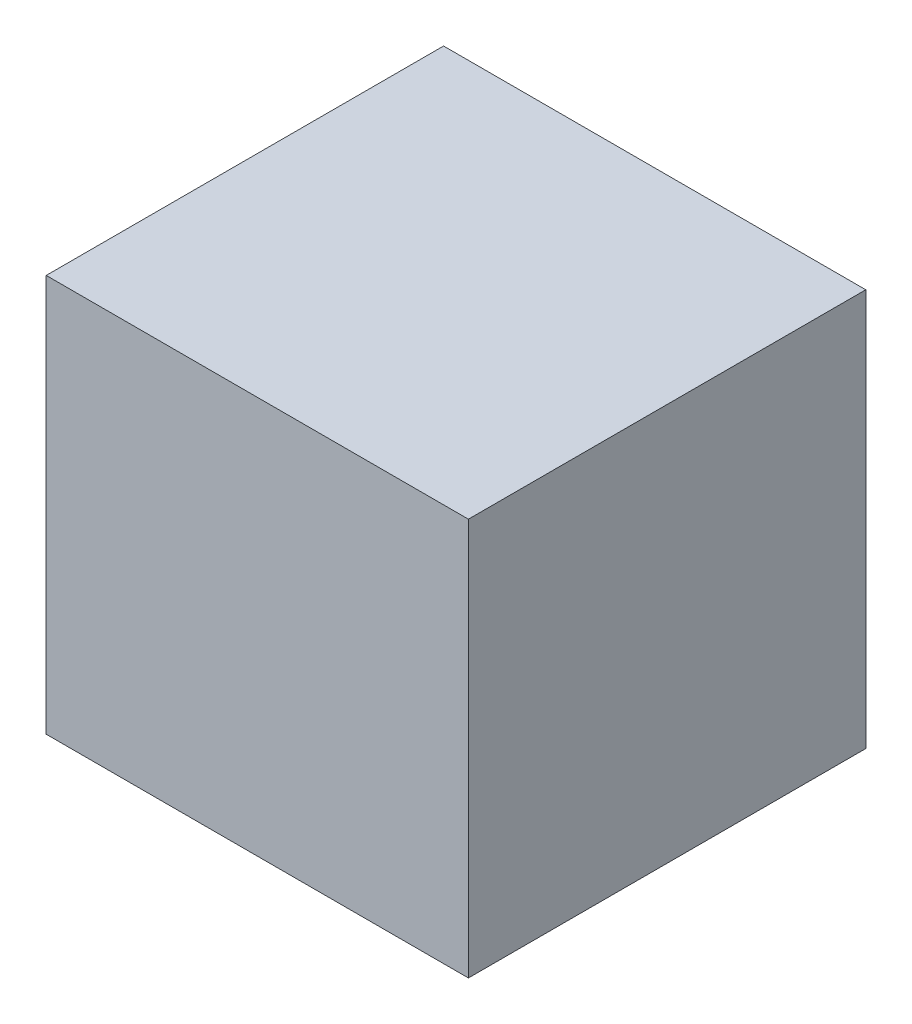
ISO-10303-21;
HEADER;
FILE_DESCRIPTION(('STEP AP214'),'2;1');
FILE_NAME('part.step','',(''),(''),'','','');
FILE_SCHEMA(('AUTOMOTIVE_DESIGN { 1 0 10303 214 1 1 1 1 }'));
ENDSEC;
DATA;
#1=APPLICATION_CONTEXT('core data for automotive mechanical design processes');
#2=APPLICATION_PROTOCOL_DEFINITION('international standard','automotive_design',2000,#1);
#3=PRODUCT_CONTEXT('',#1,'mechanical');
#4=PRODUCT('Part','Part','',(#3));
#5=PRODUCT_RELATED_PRODUCT_CATEGORY('part','',(#4));
#6=PRODUCT_DEFINITION_FORMATION('','',#4);
#7=PRODUCT_DEFINITION_CONTEXT('part definition',#1,'design');
#8=PRODUCT_DEFINITION('design','',#6,#7);
#9=PRODUCT_DEFINITION_SHAPE('','',#8);
#10=(LENGTH_UNIT() NAMED_UNIT(*) SI_UNIT(.MILLI.,.METRE.));
#11=(NAMED_UNIT(*) PLANE_ANGLE_UNIT() SI_UNIT($,.RADIAN.));
#12=(NAMED_UNIT(*) SI_UNIT($,.STERADIAN.) SOLID_ANGLE_UNIT());
#13=UNCERTAINTY_MEASURE_WITH_UNIT(LENGTH_MEASURE(1.E-05),#10,'distance_accuracy_value','');
#14=(GEOMETRIC_REPRESENTATION_CONTEXT(3) GLOBAL_UNCERTAINTY_ASSIGNED_CONTEXT((#13)) GLOBAL_UNIT_ASSIGNED_CONTEXT((#10,
#11,#12)) REPRESENTATION_CONTEXT('',''));
#15=CARTESIAN_POINT('',(0.,0.,0.));
#16=DIRECTION('',(0.,0.,1.));
#17=DIRECTION('',(1.,0.,0.));
#18=AXIS2_PLACEMENT_3D('',#15,#16,#17);
#19=CARTESIAN_POINT('',(56.,52.,16.));
#20=DIRECTION('',(0.,0.,-1.));
#21=DIRECTION('',(-1.,0.,0.));
#22=AXIS2_PLACEMENT_3D('',#19,#20,#21);
#23=PLANE('',#22);
#24=DIRECTION('',(0.,-1.,0.));
#25=VECTOR('',#24,1.);
#26=CARTESIAN_POINT('',(22.,52.,16.));
#27=LINE('',#26,#25);
#28=CARTESIAN_POINT('',(22.,84.,16.));
#29=VERTEX_POINT('',#28);
#30=CARTESIAN_POINT('',(22.,52.,16.));
#31=VERTEX_POINT('',#30);
#32=EDGE_CURVE('E222',#29,#31,#27,.T.);
#33=ORIENTED_EDGE('',*,*,#32,.T.);
#34=DIRECTION('',(-1.,0.,0.));
#35=VECTOR('',#34,1.);
#36=CARTESIAN_POINT('',(56.,52.,16.));
#37=LINE('',#36,#35);
#38=CARTESIAN_POINT('',(56.,52.,16.));
#39=VERTEX_POINT('',#38);
#40=EDGE_CURVE('E11',#39,#31,#37,.T.);
#41=ORIENTED_EDGE('',*,*,#40,.F.);
#42=DIRECTION('',(0.,-1.,0.));
#43=VECTOR('',#42,1.);
#44=CARTESIAN_POINT('',(56.,52.,16.));
#45=LINE('',#44,#43);
#46=CARTESIAN_POINT('',(56.,84.,16.));
#47=VERTEX_POINT('',#46);
#48=EDGE_CURVE('E232',#47,#39,#45,.T.);
#49=ORIENTED_EDGE('',*,*,#48,.F.);
#50=DIRECTION('',(-1.,0.,0.));
#51=VECTOR('',#50,1.);
#52=CARTESIAN_POINT('',(56.,84.,16.));
#53=LINE('',#52,#51);
#54=EDGE_CURVE('E242',#47,#29,#53,.T.);
#55=ORIENTED_EDGE('',*,*,#54,.T.);
#56=EDGE_LOOP('',(#33,#41,#49,#55));
#57=FACE_BOUND('',#56,.T.);
#58=ADVANCED_FACE('F39',(#57),#23,.F.);
#59=CARTESIAN_POINT('',(56.,52.,16.));
#60=DIRECTION('',(0.,1.,0.));
#61=DIRECTION('',(0.,0.,1.));
#62=AXIS2_PLACEMENT_3D('',#59,#60,#61);
#63=PLANE('',#62);
#64=DIRECTION('',(0.,0.,-1.));
#65=VECTOR('',#64,1.);
#66=CARTESIAN_POINT('',(22.,52.,16.));
#67=LINE('',#66,#65);
#68=CARTESIAN_POINT('',(22.,52.,-16.));
#69=VERTEX_POINT('',#68);
#70=EDGE_CURVE('E246',#31,#69,#67,.T.);
#71=ORIENTED_EDGE('',*,*,#70,.T.);
#72=DIRECTION('',(-1.,0.,0.));
#73=VECTOR('',#72,1.);
#74=CARTESIAN_POINT('',(56.,52.,-16.));
#75=LINE('',#74,#73);
#76=CARTESIAN_POINT('',(56.,52.,-16.));
#77=VERTEX_POINT('',#76);
#78=EDGE_CURVE('E47',#77,#69,#75,.T.);
#79=ORIENTED_EDGE('',*,*,#78,.F.);
#80=DIRECTION('',(0.,0.,-1.));
#81=VECTOR('',#80,1.);
#82=CARTESIAN_POINT('',(56.,52.,16.));
#83=LINE('',#82,#81);
#84=EDGE_CURVE('E91',#39,#77,#83,.T.);
#85=ORIENTED_EDGE('',*,*,#84,.F.);
#86=ORIENTED_EDGE('',*,*,#40,.T.);
#87=EDGE_LOOP('',(#71,#79,#85,#86));
#88=FACE_BOUND('',#87,.T.);
#89=ADVANCED_FACE('F280',(#88),#63,.F.);
#90=CARTESIAN_POINT('',(56.,52.,-16.));
#91=DIRECTION('',(0.,0.,1.));
#92=DIRECTION('',(1.,0.,0.));
#93=AXIS2_PLACEMENT_3D('',#90,#91,#92);
#94=PLANE('',#93);
#95=DIRECTION('',(0.,1.,0.));
#96=VECTOR('',#95,1.);
#97=CARTESIAN_POINT('',(22.,52.,-16.));
#98=LINE('',#97,#96);
#99=CARTESIAN_POINT('',(22.,84.,-16.));
#100=VERTEX_POINT('',#99);
#101=EDGE_CURVE('E249',#69,#100,#98,.T.);
#102=ORIENTED_EDGE('',*,*,#101,.T.);
#103=DIRECTION('',(-1.,0.,0.));
#104=VECTOR('',#103,1.);
#105=CARTESIAN_POINT('',(56.,84.,-16.));
#106=LINE('',#105,#104);
#107=CARTESIAN_POINT('',(56.,84.,-16.));
#108=VERTEX_POINT('',#107);
#109=EDGE_CURVE('E256',#108,#100,#106,.T.);
#110=ORIENTED_EDGE('',*,*,#109,.F.);
#111=DIRECTION('',(0.,1.,0.));
#112=VECTOR('',#111,1.);
#113=CARTESIAN_POINT('',(56.,52.,-16.));
#114=LINE('',#113,#112);
#115=EDGE_CURVE('E237',#77,#108,#114,.T.);
#116=ORIENTED_EDGE('',*,*,#115,.F.);
#117=ORIENTED_EDGE('',*,*,#78,.T.);
#118=EDGE_LOOP('',(#102,#110,#116,#117));
#119=FACE_BOUND('',#118,.T.);
#120=ADVANCED_FACE('F263',(#119),#94,.F.);
#121=CARTESIAN_POINT('',(56.,84.,16.));
#122=DIRECTION('',(0.,-1.,0.));
#123=DIRECTION('',(0.,0.,-1.));
#124=AXIS2_PLACEMENT_3D('',#121,#122,#123);
#125=PLANE('',#124);
#126=DIRECTION('',(0.,0.,1.));
#127=VECTOR('',#126,1.);
#128=CARTESIAN_POINT('',(22.,84.,16.));
#129=LINE('',#128,#127);
#130=EDGE_CURVE('E84',#100,#29,#129,.T.);
#131=ORIENTED_EDGE('',*,*,#130,.T.);
#132=ORIENTED_EDGE('',*,*,#54,.F.);
#133=DIRECTION('',(0.,0.,1.));
#134=VECTOR('',#133,1.);
#135=CARTESIAN_POINT('',(56.,84.,16.));
#136=LINE('',#135,#134);
#137=EDGE_CURVE('E63',#108,#47,#136,.T.);
#138=ORIENTED_EDGE('',*,*,#137,.F.);
#139=ORIENTED_EDGE('',*,*,#109,.T.);
#140=EDGE_LOOP('',(#131,#132,#138,#139));
#141=FACE_BOUND('',#140,.T.);
#142=ADVANCED_FACE('F271',(#141),#125,.F.);
#143=CARTESIAN_POINT('',(56.,0.,0.));
#144=DIRECTION('',(-1.,0.,0.));
#145=DIRECTION('',(0.,0.,1.));
#146=AXIS2_PLACEMENT_3D('',#143,#144,#145);
#147=PLANE('',#146);
#148=ORIENTED_EDGE('',*,*,#48,.T.);
#149=ORIENTED_EDGE('',*,*,#84,.T.);
#150=ORIENTED_EDGE('',*,*,#115,.T.);
#151=ORIENTED_EDGE('',*,*,#137,.T.);
#152=EDGE_LOOP('',(#148,#149,#150,#151));
#153=FACE_BOUND('',#152,.T.);
#154=ADVANCED_FACE('F273',(#153),#147,.F.);
#155=CARTESIAN_POINT('',(22.,0.,0.));
#156=DIRECTION('',(-1.,0.,0.));
#157=DIRECTION('',(0.,0.,1.));
#158=AXIS2_PLACEMENT_3D('',#155,#156,#157);
#159=PLANE('',#158);
#160=DIRECTION('',(0.,-1.,0.));
#161=VECTOR('',#160,1.);
#162=CARTESIAN_POINT('',(22.,61.8,6.7));
#163=LINE('',#162,#161);
#164=CARTESIAN_POINT('',(22.,74.2,6.7));
#165=VERTEX_POINT('',#164);
#166=CARTESIAN_POINT('',(22.,61.8,6.7));
#167=VERTEX_POINT('',#166);
#168=EDGE_CURVE('E198',#165,#167,#163,.T.);
#169=ORIENTED_EDGE('',*,*,#168,.T.);
#170=DIRECTION('',(0.,0.,-1.));
#171=VECTOR('',#170,1.);
#172=CARTESIAN_POINT('',(22.,61.8,6.7));
#173=LINE('',#172,#171);
#174=CARTESIAN_POINT('',(22.,61.8,-6.7));
#175=VERTEX_POINT('',#174);
#176=EDGE_CURVE('E202',#167,#175,#173,.T.);
#177=ORIENTED_EDGE('',*,*,#176,.T.);
#178=DIRECTION('',(0.,1.,0.));
#179=VECTOR('',#178,1.);
#180=CARTESIAN_POINT('',(22.,61.8,-6.7));
#181=LINE('',#180,#179);
#182=CARTESIAN_POINT('',(22.,74.2,-6.7));
#183=VERTEX_POINT('',#182);
#184=EDGE_CURVE('E54',#175,#183,#181,.T.);
#185=ORIENTED_EDGE('',*,*,#184,.T.);
#186=DIRECTION('',(0.,0.,1.));
#187=VECTOR('',#186,1.);
#188=CARTESIAN_POINT('',(22.,74.2,6.7));
#189=LINE('',#188,#187);
#190=EDGE_CURVE('E209',#183,#165,#189,.T.);
#191=ORIENTED_EDGE('',*,*,#190,.T.);
#192=EDGE_LOOP('',(#169,#177,#185,#191));
#193=FACE_BOUND('',#192,.T.);
#194=ORIENTED_EDGE('',*,*,#32,.F.);
#195=ORIENTED_EDGE('',*,*,#130,.F.);
#196=ORIENTED_EDGE('',*,*,#101,.F.);
#197=ORIENTED_EDGE('',*,*,#70,.F.);
#198=EDGE_LOOP('',(#194,#195,#196,#197));
#199=FACE_BOUND('',#198,.T.);
#200=ADVANCED_FACE('F267',(#193,#199),#159,.T.);
#201=CARTESIAN_POINT('',(22.,61.8,6.7));
#202=DIRECTION('',(0.,0.,1.));
#203=DIRECTION('',(1.,0.,0.));
#204=AXIS2_PLACEMENT_3D('',#201,#202,#203);
#205=PLANE('',#204);
#206=DIRECTION('',(1.,0.,0.));
#207=VECTOR('',#206,1.);
#208=CARTESIAN_POINT('',(22.,74.2,6.7));
#209=LINE('',#208,#207);
#210=CARTESIAN_POINT('',(32.,74.2,6.7));
#211=VERTEX_POINT('',#210);
#212=EDGE_CURVE('E219',#165,#211,#209,.T.);
#213=ORIENTED_EDGE('',*,*,#212,.T.);
#214=DIRECTION('',(0.,-1.,0.));
#215=VECTOR('',#214,1.);
#216=CARTESIAN_POINT('',(32.,58.8,6.7));
#217=LINE('',#216,#215);
#218=CARTESIAN_POINT('',(32.,77.2,6.7));
#219=VERTEX_POINT('',#218);
#220=EDGE_CURVE('E148',#219,#211,#217,.T.);
#221=ORIENTED_EDGE('',*,*,#220,.F.);
#222=DIRECTION('',(1.,0.,0.));
#223=VECTOR('',#222,1.);
#224=CARTESIAN_POINT('',(32.,77.2,6.7));
#225=LINE('',#224,#223);
#226=CARTESIAN_POINT('',(36.4,77.2,6.7));
#227=VERTEX_POINT('',#226);
#228=EDGE_CURVE('E190',#219,#227,#225,.T.);
#229=ORIENTED_EDGE('',*,*,#228,.T.);
#230=DIRECTION('',(0.,-1.,0.));
#231=VECTOR('',#230,1.);
#232=CARTESIAN_POINT('',(36.4,58.8,6.7));
#233=LINE('',#232,#231);
#234=CARTESIAN_POINT('',(36.4,58.8,6.7));
#235=VERTEX_POINT('',#234);
#236=EDGE_CURVE('E156',#227,#235,#233,.T.);
#237=ORIENTED_EDGE('',*,*,#236,.T.);
#238=DIRECTION('',(1.,0.,0.));
#239=VECTOR('',#238,1.);
#240=CARTESIAN_POINT('',(32.,58.8,6.7));
#241=LINE('',#240,#239);
#242=CARTESIAN_POINT('',(32.,58.8,6.7));
#243=VERTEX_POINT('',#242);
#244=EDGE_CURVE('E152',#243,#235,#241,.T.);
#245=ORIENTED_EDGE('',*,*,#244,.F.);
#246=CARTESIAN_POINT('',(32.,61.8,6.7));
#247=VERTEX_POINT('',#246);
#248=EDGE_CURVE('E138',#247,#243,#217,.T.);
#249=ORIENTED_EDGE('',*,*,#248,.F.);
#250=DIRECTION('',(1.,0.,0.));
#251=VECTOR('',#250,1.);
#252=CARTESIAN_POINT('',(22.,61.8,6.7));
#253=LINE('',#252,#251);
#254=EDGE_CURVE('E213',#167,#247,#253,.T.);
#255=ORIENTED_EDGE('',*,*,#254,.F.);
#256=ORIENTED_EDGE('',*,*,#168,.F.);
#257=EDGE_LOOP('',(#213,#221,#229,#237,#245,#249,#255,#256));
#258=FACE_BOUND('',#257,.T.);
#259=ADVANCED_FACE('F154',(#258),#205,.F.);
#260=CARTESIAN_POINT('',(22.,74.2,6.7));
#261=DIRECTION('',(0.,1.,0.));
#262=DIRECTION('',(0.,0.,1.));
#263=AXIS2_PLACEMENT_3D('',#260,#261,#262);
#264=PLANE('',#263);
#265=DIRECTION('',(0.,0.,1.));
#266=VECTOR('',#265,1.);
#267=CARTESIAN_POINT('',(32.,74.2,6.7));
#268=LINE('',#267,#266);
#269=CARTESIAN_POINT('',(32.,74.2,-6.7));
#270=VERTEX_POINT('',#269);
#271=EDGE_CURVE('E203',#270,#211,#268,.T.);
#272=ORIENTED_EDGE('',*,*,#271,.T.);
#273=ORIENTED_EDGE('',*,*,#212,.F.);
#274=ORIENTED_EDGE('',*,*,#190,.F.);
#275=DIRECTION('',(1.,0.,0.));
#276=VECTOR('',#275,1.);
#277=CARTESIAN_POINT('',(22.,74.2,-6.7));
#278=LINE('',#277,#276);
#279=EDGE_CURVE('E223',#183,#270,#278,.T.);
#280=ORIENTED_EDGE('',*,*,#279,.T.);
#281=EDGE_LOOP('',(#272,#273,#274,#280));
#282=FACE_BOUND('',#281,.T.);
#283=ADVANCED_FACE('F321',(#282),#264,.F.);
#284=CARTESIAN_POINT('',(22.,61.8,-6.7));
#285=DIRECTION('',(0.,0.,-1.));
#286=DIRECTION('',(-1.,0.,0.));
#287=AXIS2_PLACEMENT_3D('',#284,#285,#286);
#288=PLANE('',#287);
#289=DIRECTION('',(1.,0.,0.));
#290=VECTOR('',#289,1.);
#291=CARTESIAN_POINT('',(22.,61.8,-6.7));
#292=LINE('',#291,#290);
#293=CARTESIAN_POINT('',(32.,61.8,-6.7));
#294=VERTEX_POINT('',#293);
#295=EDGE_CURVE('E227',#175,#294,#292,.T.);
#296=ORIENTED_EDGE('',*,*,#295,.T.);
#297=DIRECTION('',(0.,1.,0.));
#298=VECTOR('',#297,1.);
#299=CARTESIAN_POINT('',(32.,58.8,-6.7));
#300=LINE('',#299,#298);
#301=CARTESIAN_POINT('',(32.,58.8,-6.7));
#302=VERTEX_POINT('',#301);
#303=EDGE_CURVE('E171',#302,#294,#300,.T.);
#304=ORIENTED_EDGE('',*,*,#303,.F.);
#305=DIRECTION('',(1.,0.,0.));
#306=VECTOR('',#305,1.);
#307=CARTESIAN_POINT('',(32.,58.8,-6.7));
#308=LINE('',#307,#306);
#309=CARTESIAN_POINT('',(36.4,58.8,-6.7));
#310=VERTEX_POINT('',#309);
#311=EDGE_CURVE('E161',#302,#310,#308,.T.);
#312=ORIENTED_EDGE('',*,*,#311,.T.);
#313=DIRECTION('',(0.,1.,0.));
#314=VECTOR('',#313,1.);
#315=CARTESIAN_POINT('',(36.4,58.8,-6.7));
#316=LINE('',#315,#314);
#317=CARTESIAN_POINT('',(36.4,77.2,-6.7));
#318=VERTEX_POINT('',#317);
#319=EDGE_CURVE('E183',#310,#318,#316,.T.);
#320=ORIENTED_EDGE('',*,*,#319,.T.);
#321=DIRECTION('',(1.,0.,0.));
#322=VECTOR('',#321,1.);
#323=CARTESIAN_POINT('',(32.,77.2,-6.7));
#324=LINE('',#323,#322);
#325=CARTESIAN_POINT('',(32.,77.2,-6.7));
#326=VERTEX_POINT('',#325);
#327=EDGE_CURVE('E193',#326,#318,#324,.T.);
#328=ORIENTED_EDGE('',*,*,#327,.F.);
#329=EDGE_CURVE('E167',#270,#326,#300,.T.);
#330=ORIENTED_EDGE('',*,*,#329,.F.);
#331=ORIENTED_EDGE('',*,*,#279,.F.);
#332=ORIENTED_EDGE('',*,*,#184,.F.);
#333=EDGE_LOOP('',(#296,#304,#312,#320,#328,#330,#331,#332));
#334=FACE_BOUND('',#333,.T.);
#335=ADVANCED_FACE('F332',(#334),#288,.F.);
#336=CARTESIAN_POINT('',(22.,61.8,6.7));
#337=DIRECTION('',(0.,-1.,0.));
#338=DIRECTION('',(0.,0.,-1.));
#339=AXIS2_PLACEMENT_3D('',#336,#337,#338);
#340=PLANE('',#339);
#341=DIRECTION('',(0.,0.,-1.));
#342=VECTOR('',#341,1.);
#343=CARTESIAN_POINT('',(32.,61.8,6.7));
#344=LINE('',#343,#342);
#345=EDGE_CURVE('E144',#247,#294,#344,.T.);
#346=ORIENTED_EDGE('',*,*,#345,.T.);
#347=ORIENTED_EDGE('',*,*,#295,.F.);
#348=ORIENTED_EDGE('',*,*,#176,.F.);
#349=ORIENTED_EDGE('',*,*,#254,.T.);
#350=EDGE_LOOP('',(#346,#347,#348,#349));
#351=FACE_BOUND('',#350,.T.);
#352=ADVANCED_FACE('F342',(#351),#340,.F.);
#353=CARTESIAN_POINT('',(32.,0.,0.));
#354=DIRECTION('',(-1.,0.,0.));
#355=DIRECTION('',(0.,0.,1.));
#356=AXIS2_PLACEMENT_3D('',#353,#354,#355);
#357=PLANE('',#356);
#358=ORIENTED_EDGE('',*,*,#329,.T.);
#359=DIRECTION('',(0.,0.,1.));
#360=VECTOR('',#359,1.);
#361=CARTESIAN_POINT('',(32.,77.2,6.7));
#362=LINE('',#361,#360);
#363=EDGE_CURVE('E162',#326,#219,#362,.T.);
#364=ORIENTED_EDGE('',*,*,#363,.T.);
#365=ORIENTED_EDGE('',*,*,#220,.T.);
#366=ORIENTED_EDGE('',*,*,#271,.F.);
#367=EDGE_LOOP('',(#358,#364,#365,#366));
#368=FACE_BOUND('',#367,.T.);
#369=ADVANCED_FACE('F351',(#368),#357,.F.);
#370=ORIENTED_EDGE('',*,*,#248,.T.);
#371=DIRECTION('',(0.,0.,-1.));
#372=VECTOR('',#371,1.);
#373=CARTESIAN_POINT('',(32.,58.8,6.7));
#374=LINE('',#373,#372);
#375=EDGE_CURVE('E142',#243,#302,#374,.T.);
#376=ORIENTED_EDGE('',*,*,#375,.T.);
#377=ORIENTED_EDGE('',*,*,#303,.T.);
#378=ORIENTED_EDGE('',*,*,#345,.F.);
#379=EDGE_LOOP('',(#370,#376,#377,#378));
#380=FACE_BOUND('',#379,.T.);
#381=ADVANCED_FACE('F140',(#380),#357,.F.);
#382=CARTESIAN_POINT('',(32.,77.2,6.7));
#383=DIRECTION('',(0.,1.,0.));
#384=DIRECTION('',(0.,0.,1.));
#385=AXIS2_PLACEMENT_3D('',#382,#383,#384);
#386=PLANE('',#385);
#387=DIRECTION('',(0.,0.,1.));
#388=VECTOR('',#387,1.);
#389=CARTESIAN_POINT('',(36.4,77.2,6.7));
#390=LINE('',#389,#388);
#391=EDGE_CURVE('E149',#318,#227,#390,.T.);
#392=ORIENTED_EDGE('',*,*,#391,.T.);
#393=ORIENTED_EDGE('',*,*,#228,.F.);
#394=ORIENTED_EDGE('',*,*,#363,.F.);
#395=ORIENTED_EDGE('',*,*,#327,.T.);
#396=EDGE_LOOP('',(#392,#393,#394,#395));
#397=FACE_BOUND('',#396,.T.);
#398=ADVANCED_FACE('F369',(#397),#386,.F.);
#399=CARTESIAN_POINT('',(32.,58.8,6.7));
#400=DIRECTION('',(0.,-1.,0.));
#401=DIRECTION('',(0.,0.,-1.));
#402=AXIS2_PLACEMENT_3D('',#399,#400,#401);
#403=PLANE('',#402);
#404=DIRECTION('',(0.,0.,-1.));
#405=VECTOR('',#404,1.);
#406=CARTESIAN_POINT('',(36.4,58.8,6.7));
#407=LINE('',#406,#405);
#408=EDGE_CURVE('E180',#235,#310,#407,.T.);
#409=ORIENTED_EDGE('',*,*,#408,.T.);
#410=ORIENTED_EDGE('',*,*,#311,.F.);
#411=ORIENTED_EDGE('',*,*,#375,.F.);
#412=ORIENTED_EDGE('',*,*,#244,.T.);
#413=EDGE_LOOP('',(#409,#410,#411,#412));
#414=FACE_BOUND('',#413,.T.);
#415=ADVANCED_FACE('F164',(#414),#403,.F.);
#416=CARTESIAN_POINT('',(36.4,0.,0.));
#417=DIRECTION('',(-1.,0.,0.));
#418=DIRECTION('',(0.,0.,1.));
#419=AXIS2_PLACEMENT_3D('',#416,#417,#418);
#420=PLANE('',#419);
#421=ORIENTED_EDGE('',*,*,#236,.F.);
#422=ORIENTED_EDGE('',*,*,#391,.F.);
#423=ORIENTED_EDGE('',*,*,#319,.F.);
#424=ORIENTED_EDGE('',*,*,#408,.F.);
#425=EDGE_LOOP('',(#421,#422,#423,#424));
#426=FACE_BOUND('',#425,.T.);
#427=ADVANCED_FACE('F386',(#426),#420,.T.);
#428=CLOSED_SHELL('',(#58,#89,#120,#142,#154,#200,#259,#283,#335,#352,#369,#381,#398,#415,#427));
#429=MANIFOLD_SOLID_BREP('B2',#428);
#430=ADVANCED_BREP_SHAPE_REPRESENTATION('',(#18,#429),#14);
#431=SHAPE_DEFINITION_REPRESENTATION(#9,#430);
ENDSEC;
END-ISO-10303-21;
